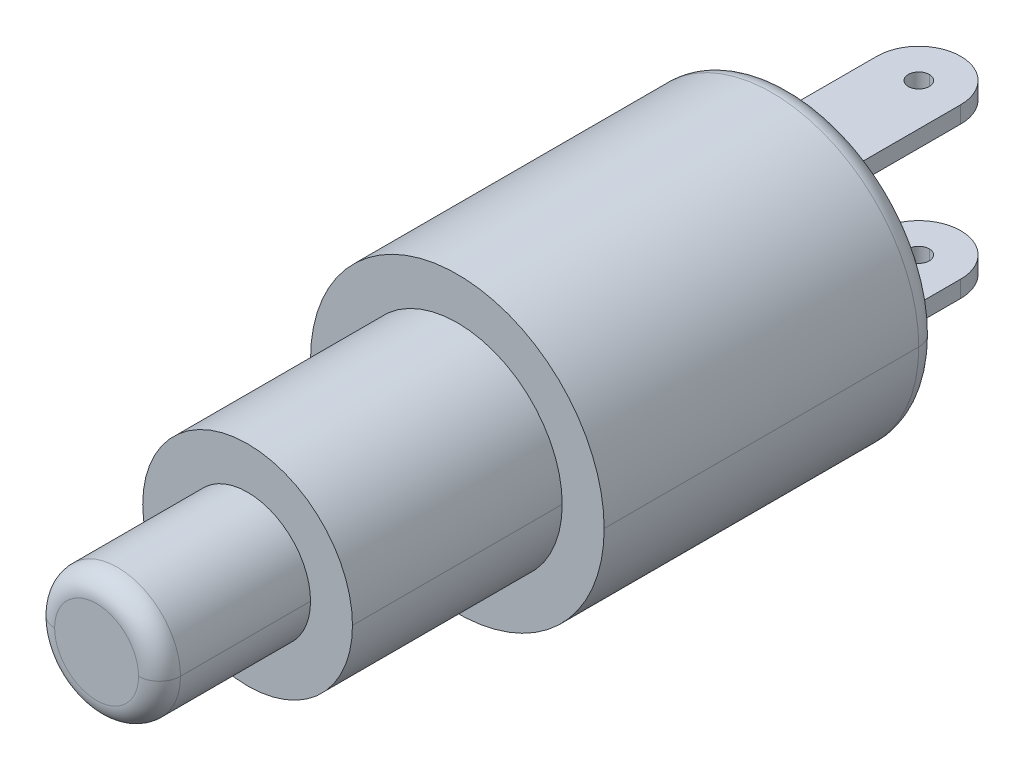
ISO-10303-21;
HEADER;
FILE_DESCRIPTION(('STEP AP214'),'2;1');
FILE_NAME('part.step','',(''),(''),'','','');
FILE_SCHEMA(('AUTOMOTIVE_DESIGN { 1 0 10303 214 1 1 1 1 }'));
ENDSEC;
DATA;
#1=APPLICATION_CONTEXT('core data for automotive mechanical design processes');
#2=APPLICATION_PROTOCOL_DEFINITION('international standard','automotive_design',2000,#1);
#3=PRODUCT_CONTEXT('',#1,'mechanical');
#4=PRODUCT('Part','Part','',(#3));
#5=PRODUCT_RELATED_PRODUCT_CATEGORY('part','',(#4));
#6=PRODUCT_DEFINITION_FORMATION('','',#4);
#7=PRODUCT_DEFINITION_CONTEXT('part definition',#1,'design');
#8=PRODUCT_DEFINITION('design','',#6,#7);
#9=PRODUCT_DEFINITION_SHAPE('','',#8);
#10=(LENGTH_UNIT() NAMED_UNIT(*) SI_UNIT(.MILLI.,.METRE.));
#11=(NAMED_UNIT(*) PLANE_ANGLE_UNIT() SI_UNIT($,.RADIAN.));
#12=(NAMED_UNIT(*) SI_UNIT($,.STERADIAN.) SOLID_ANGLE_UNIT());
#13=UNCERTAINTY_MEASURE_WITH_UNIT(LENGTH_MEASURE(1.E-05),#10,'distance_accuracy_value','');
#14=(GEOMETRIC_REPRESENTATION_CONTEXT(3) GLOBAL_UNCERTAINTY_ASSIGNED_CONTEXT((#13)) GLOBAL_UNIT_ASSIGNED_CONTEXT((#10,
#11,#12)) REPRESENTATION_CONTEXT('',''));
#15=CARTESIAN_POINT('',(0.,0.,0.));
#16=DIRECTION('',(0.,0.,1.));
#17=DIRECTION('',(1.,0.,0.));
#18=AXIS2_PLACEMENT_3D('',#15,#16,#17);
#19=CARTESIAN_POINT('',(0.,-2.,-3.));
#20=DIRECTION('',(0.,1.,0.));
#21=DIRECTION('',(0.,0.,1.));
#22=AXIS2_PLACEMENT_3D('',#19,#20,#21);
#23=CYLINDRICAL_SURFACE('',#22,0.25);
#24=DIRECTION('',(0.,1.,0.));
#25=VECTOR('',#24,1.);
#26=CARTESIAN_POINT('',(0.,-2.,-3.25));
#27=LINE('',#26,#25);
#28=CARTESIAN_POINT('',(0.,-2.,-3.25));
#29=VERTEX_POINT('',#28);
#30=CARTESIAN_POINT('',(0.,-1.6,-3.25));
#31=VERTEX_POINT('',#30);
#32=EDGE_CURVE('E698',#29,#31,#27,.T.);
#33=ORIENTED_EDGE('',*,*,#32,.F.);
#34=CARTESIAN_POINT('',(0.,-2.,-3.));
#35=DIRECTION('',(0.,1.,0.));
#36=DIRECTION('',(0.,0.,1.));
#37=AXIS2_PLACEMENT_3D('',#34,#35,#36);
#38=CIRCLE('',#37,0.25);
#39=CARTESIAN_POINT('',(0.,-2.,-2.75));
#40=VERTEX_POINT('',#39);
#41=EDGE_CURVE('E355',#40,#29,#38,.T.);
#42=ORIENTED_EDGE('',*,*,#41,.F.);
#43=DIRECTION('',(0.,1.,0.));
#44=VECTOR('',#43,1.);
#45=CARTESIAN_POINT('',(0.,-2.,-2.75));
#46=LINE('',#45,#44);
#47=CARTESIAN_POINT('',(0.,-1.6,-2.75));
#48=VERTEX_POINT('',#47);
#49=EDGE_CURVE('E682',#40,#48,#46,.T.);
#50=ORIENTED_EDGE('',*,*,#49,.T.);
#51=CARTESIAN_POINT('',(0.,-1.6,-3.));
#52=DIRECTION('',(0.,-1.,0.));
#53=DIRECTION('',(0.,0.,-1.));
#54=AXIS2_PLACEMENT_3D('',#51,#52,#53);
#55=CIRCLE('',#54,0.25);
#56=EDGE_CURVE('E371',#31,#48,#55,.T.);
#57=ORIENTED_EDGE('',*,*,#56,.F.);
#58=EDGE_LOOP('',(#33,#42,#50,#57));
#59=FACE_BOUND('',#58,.T.);
#60=ADVANCED_FACE('F17',(#59),#23,.F.);
#61=CARTESIAN_POINT('',(0.,-2.,-3.));
#62=DIRECTION('',(0.,1.,0.));
#63=DIRECTION('',(0.,0.,1.));
#64=AXIS2_PLACEMENT_3D('',#61,#62,#63);
#65=CYLINDRICAL_SURFACE('',#64,0.25);
#66=DIRECTION('',(0.,1.,0.));
#67=VECTOR('',#66,1.);
#68=CARTESIAN_POINT('',(0.,-2.,-3.25));
#69=LINE('',#68,#67);
#70=CARTESIAN_POINT('',(0.,1.6,-3.25));
#71=VERTEX_POINT('',#70);
#72=CARTESIAN_POINT('',(0.,2.,-3.25));
#73=VERTEX_POINT('',#72);
#74=EDGE_CURVE('E670',#71,#73,#69,.T.);
#75=ORIENTED_EDGE('',*,*,#74,.F.);
#76=CARTESIAN_POINT('',(0.,1.6,-3.));
#77=DIRECTION('',(0.,1.,0.));
#78=DIRECTION('',(0.,0.,1.));
#79=AXIS2_PLACEMENT_3D('',#76,#77,#78);
#80=CIRCLE('',#79,0.25);
#81=CARTESIAN_POINT('',(0.,1.6,-2.75));
#82=VERTEX_POINT('',#81);
#83=EDGE_CURVE('E11',#82,#71,#80,.T.);
#84=ORIENTED_EDGE('',*,*,#83,.F.);
#85=DIRECTION('',(0.,1.,0.));
#86=VECTOR('',#85,1.);
#87=CARTESIAN_POINT('',(0.,-2.,-2.75));
#88=LINE('',#87,#86);
#89=CARTESIAN_POINT('',(0.,2.,-2.75));
#90=VERTEX_POINT('',#89);
#91=EDGE_CURVE('E657',#82,#90,#88,.T.);
#92=ORIENTED_EDGE('',*,*,#91,.T.);
#93=CARTESIAN_POINT('',(0.,2.,-3.));
#94=DIRECTION('',(0.,1.,0.));
#95=DIRECTION('',(0.,0.,1.));
#96=AXIS2_PLACEMENT_3D('',#93,#94,#95);
#97=CIRCLE('',#96,0.25);
#98=EDGE_CURVE('E397',#90,#73,#97,.T.);
#99=ORIENTED_EDGE('',*,*,#98,.T.);
#100=EDGE_LOOP('',(#75,#84,#92,#99));
#101=FACE_BOUND('',#100,.T.);
#102=ADVANCED_FACE('F772',(#101),#65,.F.);
#103=CARTESIAN_POINT('',(1.,1.6,-4.));
#104=DIRECTION('',(0.,1.,0.));
#105=DIRECTION('',(1.,0.,0.));
#106=AXIS2_PLACEMENT_3D('',#103,#104,#105);
#107=PLANE('',#106);
#108=ORIENTED_EDGE('',*,*,#83,.T.);
#109=CARTESIAN_POINT('',(0.,1.6,-3.));
#110=DIRECTION('',(0.,1.,0.));
#111=DIRECTION('',(0.,0.,1.));
#112=AXIS2_PLACEMENT_3D('',#109,#110,#111);
#113=CIRCLE('',#112,0.25);
#114=EDGE_CURVE('E675',#71,#82,#113,.T.);
#115=ORIENTED_EDGE('',*,*,#114,.T.);
#116=EDGE_LOOP('',(#108,#115));
#117=FACE_BOUND('',#116,.T.);
#118=DIRECTION('',(0.,0.,1.));
#119=VECTOR('',#118,1.);
#120=CARTESIAN_POINT('',(-1.,1.6,-4.));
#121=LINE('',#120,#119);
#122=CARTESIAN_POINT('',(-1.,1.6,-3.));
#123=VERTEX_POINT('',#122);
#124=CARTESIAN_POINT('',(-1.,1.6,0.));
#125=VERTEX_POINT('',#124);
#126=EDGE_CURVE('E370',#123,#125,#121,.T.);
#127=ORIENTED_EDGE('',*,*,#126,.F.);
#128=CARTESIAN_POINT('',(0.,1.6,-3.));
#129=DIRECTION('',(0.,-1.,0.));
#130=DIRECTION('',(0.,0.,1.));
#131=AXIS2_PLACEMENT_3D('',#128,#129,#130);
#132=CIRCLE('',#131,1.);
#133=CARTESIAN_POINT('',(0.,1.6,-4.));
#134=VERTEX_POINT('',#133);
#135=EDGE_CURVE('E308',#123,#134,#132,.T.);
#136=ORIENTED_EDGE('',*,*,#135,.T.);
#137=CARTESIAN_POINT('',(0.,1.6,-3.));
#138=DIRECTION('',(0.,-1.,0.));
#139=DIRECTION('',(0.,0.,1.));
#140=AXIS2_PLACEMENT_3D('',#137,#138,#139);
#141=CIRCLE('',#140,1.);
#142=CARTESIAN_POINT('',(1.,1.6,-3.));
#143=VERTEX_POINT('',#142);
#144=EDGE_CURVE('E338',#134,#143,#141,.T.);
#145=ORIENTED_EDGE('',*,*,#144,.T.);
#146=DIRECTION('',(0.,0.,1.));
#147=VECTOR('',#146,1.);
#148=CARTESIAN_POINT('',(1.,1.6,-4.));
#149=LINE('',#148,#147);
#150=CARTESIAN_POINT('',(1.,1.6,0.));
#151=VERTEX_POINT('',#150);
#152=EDGE_CURVE('E25',#143,#151,#149,.T.);
#153=ORIENTED_EDGE('',*,*,#152,.T.);
#154=DIRECTION('',(-1.,0.,0.));
#155=VECTOR('',#154,1.);
#156=CARTESIAN_POINT('',(1.,1.6,0.));
#157=LINE('',#156,#155);
#158=EDGE_CURVE('E291',#151,#125,#157,.T.);
#159=ORIENTED_EDGE('',*,*,#158,.T.);
#160=EDGE_LOOP('',(#127,#136,#145,#153,#159));
#161=FACE_BOUND('',#160,.T.);
#162=ADVANCED_FACE('F776',(#117,#161),#107,.F.);
#163=CARTESIAN_POINT('',(1.,2.,-4.));
#164=DIRECTION('',(-1.,0.,0.));
#165=DIRECTION('',(0.,0.,1.));
#166=AXIS2_PLACEMENT_3D('',#163,#164,#165);
#167=PLANE('',#166);
#168=ORIENTED_EDGE('',*,*,#152,.F.);
#169=DIRECTION('',(0.,1.,0.));
#170=VECTOR('',#169,1.);
#171=CARTESIAN_POINT('',(1.,1.6,-3.));
#172=LINE('',#171,#170);
#173=CARTESIAN_POINT('',(1.,2.,-3.));
#174=VERTEX_POINT('',#173);
#175=EDGE_CURVE('E335',#143,#174,#172,.T.);
#176=ORIENTED_EDGE('',*,*,#175,.T.);
#177=DIRECTION('',(0.,0.,1.));
#178=VECTOR('',#177,1.);
#179=CARTESIAN_POINT('',(1.,2.,-4.));
#180=LINE('',#179,#178);
#181=CARTESIAN_POINT('',(1.,2.,0.));
#182=VERTEX_POINT('',#181);
#183=EDGE_CURVE('E38',#174,#182,#180,.T.);
#184=ORIENTED_EDGE('',*,*,#183,.T.);
#185=DIRECTION('',(0.,-1.,0.));
#186=VECTOR('',#185,1.);
#187=CARTESIAN_POINT('',(1.,2.,0.));
#188=LINE('',#187,#186);
#189=EDGE_CURVE('E287',#182,#151,#188,.T.);
#190=ORIENTED_EDGE('',*,*,#189,.T.);
#191=EDGE_LOOP('',(#168,#176,#184,#190));
#192=FACE_BOUND('',#191,.T.);
#193=ADVANCED_FACE('F781',(#192),#167,.F.);
#194=CARTESIAN_POINT('',(1.,2.,-4.));
#195=DIRECTION('',(0.,-1.,0.));
#196=DIRECTION('',(0.,0.,-1.));
#197=AXIS2_PLACEMENT_3D('',#194,#195,#196);
#198=PLANE('',#197);
#199=ORIENTED_EDGE('',*,*,#98,.F.);
#200=CARTESIAN_POINT('',(0.,2.,-3.));
#201=DIRECTION('',(0.,1.,0.));
#202=DIRECTION('',(0.,0.,1.));
#203=AXIS2_PLACEMENT_3D('',#200,#201,#202);
#204=CIRCLE('',#203,0.25);
#205=EDGE_CURVE('E624',#73,#90,#204,.T.);
#206=ORIENTED_EDGE('',*,*,#205,.F.);
#207=EDGE_LOOP('',(#199,#206));
#208=FACE_BOUND('',#207,.T.);
#209=ORIENTED_EDGE('',*,*,#183,.F.);
#210=CARTESIAN_POINT('',(0.,2.,-3.));
#211=DIRECTION('',(0.,1.,0.));
#212=DIRECTION('',(0.,0.,-1.));
#213=AXIS2_PLACEMENT_3D('',#210,#211,#212);
#214=CIRCLE('',#213,1.);
#215=CARTESIAN_POINT('',(0.,2.,-4.));
#216=VERTEX_POINT('',#215);
#217=EDGE_CURVE('E332',#174,#216,#214,.T.);
#218=ORIENTED_EDGE('',*,*,#217,.T.);
#219=CARTESIAN_POINT('',(0.,2.,-3.));
#220=DIRECTION('',(0.,1.,0.));
#221=DIRECTION('',(0.,0.,-1.));
#222=AXIS2_PLACEMENT_3D('',#219,#220,#221);
#223=CIRCLE('',#222,1.);
#224=CARTESIAN_POINT('',(-1.,2.,-3.));
#225=VERTEX_POINT('',#224);
#226=EDGE_CURVE('E234',#216,#225,#223,.T.);
#227=ORIENTED_EDGE('',*,*,#226,.T.);
#228=DIRECTION('',(0.,0.,1.));
#229=VECTOR('',#228,1.);
#230=CARTESIAN_POINT('',(-1.,2.,-4.));
#231=LINE('',#230,#229);
#232=CARTESIAN_POINT('',(-1.,2.,0.));
#233=VERTEX_POINT('',#232);
#234=EDGE_CURVE('E367',#225,#233,#231,.T.);
#235=ORIENTED_EDGE('',*,*,#234,.T.);
#236=DIRECTION('',(1.,0.,0.));
#237=VECTOR('',#236,1.);
#238=CARTESIAN_POINT('',(1.,2.,0.));
#239=LINE('',#238,#237);
#240=EDGE_CURVE('E290',#233,#182,#239,.T.);
#241=ORIENTED_EDGE('',*,*,#240,.T.);
#242=EDGE_LOOP('',(#209,#218,#227,#235,#241));
#243=FACE_BOUND('',#242,.T.);
#244=ADVANCED_FACE('F788',(#208,#243),#198,.F.);
#245=CARTESIAN_POINT('',(-1.,2.,-4.));
#246=DIRECTION('',(1.,0.,0.));
#247=DIRECTION('',(0.,1.,0.));
#248=AXIS2_PLACEMENT_3D('',#245,#246,#247);
#249=PLANE('',#248);
#250=ORIENTED_EDGE('',*,*,#234,.F.);
#251=DIRECTION('',(0.,-1.,0.));
#252=VECTOR('',#251,1.);
#253=CARTESIAN_POINT('',(-1.,1.6,-3.));
#254=LINE('',#253,#252);
#255=EDGE_CURVE('E312',#225,#123,#254,.T.);
#256=ORIENTED_EDGE('',*,*,#255,.T.);
#257=ORIENTED_EDGE('',*,*,#126,.T.);
#258=DIRECTION('',(0.,1.,0.));
#259=VECTOR('',#258,1.);
#260=CARTESIAN_POINT('',(-1.,2.,0.));
#261=LINE('',#260,#259);
#262=EDGE_CURVE('E354',#125,#233,#261,.T.);
#263=ORIENTED_EDGE('',*,*,#262,.T.);
#264=EDGE_LOOP('',(#250,#256,#257,#263));
#265=FACE_BOUND('',#264,.T.);
#266=ADVANCED_FACE('F742',(#265),#249,.F.);
#267=CARTESIAN_POINT('',(1.,-1.6,-4.));
#268=DIRECTION('',(0.,-1.,0.));
#269=DIRECTION('',(0.,0.,-1.));
#270=AXIS2_PLACEMENT_3D('',#267,#268,#269);
#271=PLANE('',#270);
#272=CARTESIAN_POINT('',(0.,-1.6,-3.));
#273=DIRECTION('',(0.,-1.,0.));
#274=DIRECTION('',(0.,0.,-1.));
#275=AXIS2_PLACEMENT_3D('',#272,#273,#274);
#276=CIRCLE('',#275,0.25);
#277=EDGE_CURVE('E690',#48,#31,#276,.T.);
#278=ORIENTED_EDGE('',*,*,#277,.T.);
#279=ORIENTED_EDGE('',*,*,#56,.T.);
#280=EDGE_LOOP('',(#278,#279));
#281=FACE_BOUND('',#280,.T.);
#282=DIRECTION('',(0.,0.,1.));
#283=VECTOR('',#282,1.);
#284=CARTESIAN_POINT('',(1.,-1.6,-4.));
#285=LINE('',#284,#283);
#286=CARTESIAN_POINT('',(1.,-1.6,-3.));
#287=VERTEX_POINT('',#286);
#288=CARTESIAN_POINT('',(1.,-1.6,0.));
#289=VERTEX_POINT('',#288);
#290=EDGE_CURVE('E384',#287,#289,#285,.T.);
#291=ORIENTED_EDGE('',*,*,#290,.F.);
#292=CARTESIAN_POINT('',(0.,-1.6,-3.));
#293=DIRECTION('',(0.,1.,0.));
#294=DIRECTION('',(0.,0.,-1.));
#295=AXIS2_PLACEMENT_3D('',#292,#293,#294);
#296=CIRCLE('',#295,1.);
#297=CARTESIAN_POINT('',(-1.,-1.6,-3.));
#298=VERTEX_POINT('',#297);
#299=EDGE_CURVE('E320',#287,#298,#296,.T.);
#300=ORIENTED_EDGE('',*,*,#299,.T.);
#301=DIRECTION('',(0.,0.,1.));
#302=VECTOR('',#301,1.);
#303=CARTESIAN_POINT('',(-1.,-1.6,-4.));
#304=LINE('',#303,#302);
#305=CARTESIAN_POINT('',(-1.,-1.6,0.));
#306=VERTEX_POINT('',#305);
#307=EDGE_CURVE('E358',#298,#306,#304,.T.);
#308=ORIENTED_EDGE('',*,*,#307,.T.);
#309=DIRECTION('',(1.,0.,0.));
#310=VECTOR('',#309,1.);
#311=CARTESIAN_POINT('',(1.,-1.6,0.));
#312=LINE('',#311,#310);
#313=EDGE_CURVE('E345',#306,#289,#312,.T.);
#314=ORIENTED_EDGE('',*,*,#313,.T.);
#315=EDGE_LOOP('',(#291,#300,#308,#314));
#316=FACE_BOUND('',#315,.T.);
#317=ADVANCED_FACE('F738',(#281,#316),#271,.F.);
#318=CARTESIAN_POINT('',(-1.,-1.6,-4.));
#319=DIRECTION('',(1.,0.,0.));
#320=DIRECTION('',(0.,-1.,0.));
#321=AXIS2_PLACEMENT_3D('',#318,#319,#320);
#322=PLANE('',#321);
#323=ORIENTED_EDGE('',*,*,#307,.F.);
#324=DIRECTION('',(0.,-1.,0.));
#325=VECTOR('',#324,1.);
#326=CARTESIAN_POINT('',(-1.,-1.6,-3.));
#327=LINE('',#326,#325);
#328=CARTESIAN_POINT('',(-1.,-2.,-3.));
#329=VERTEX_POINT('',#328);
#330=EDGE_CURVE('E316',#298,#329,#327,.T.);
#331=ORIENTED_EDGE('',*,*,#330,.T.);
#332=DIRECTION('',(0.,0.,1.));
#333=VECTOR('',#332,1.);
#334=CARTESIAN_POINT('',(-1.,-2.,-4.));
#335=LINE('',#334,#333);
#336=CARTESIAN_POINT('',(-1.,-2.,0.));
#337=VERTEX_POINT('',#336);
#338=EDGE_CURVE('E359',#329,#337,#335,.T.);
#339=ORIENTED_EDGE('',*,*,#338,.T.);
#340=DIRECTION('',(0.,1.,0.));
#341=VECTOR('',#340,1.);
#342=CARTESIAN_POINT('',(-1.,-1.6,0.));
#343=LINE('',#342,#341);
#344=EDGE_CURVE('E349',#337,#306,#343,.T.);
#345=ORIENTED_EDGE('',*,*,#344,.T.);
#346=EDGE_LOOP('',(#323,#331,#339,#345));
#347=FACE_BOUND('',#346,.T.);
#348=ADVANCED_FACE('F741',(#347),#322,.F.);
#349=CARTESIAN_POINT('',(1.,-2.,-4.));
#350=DIRECTION('',(0.,1.,0.));
#351=DIRECTION('',(1.,0.,0.));
#352=AXIS2_PLACEMENT_3D('',#349,#350,#351);
#353=PLANE('',#352);
#354=ORIENTED_EDGE('',*,*,#41,.T.);
#355=CARTESIAN_POINT('',(0.,-2.,-3.));
#356=DIRECTION('',(0.,1.,0.));
#357=DIRECTION('',(0.,0.,1.));
#358=AXIS2_PLACEMENT_3D('',#355,#356,#357);
#359=CIRCLE('',#358,0.25);
#360=EDGE_CURVE('E705',#29,#40,#359,.T.);
#361=ORIENTED_EDGE('',*,*,#360,.T.);
#362=EDGE_LOOP('',(#354,#361));
#363=FACE_BOUND('',#362,.T.);
#364=ORIENTED_EDGE('',*,*,#338,.F.);
#365=CARTESIAN_POINT('',(0.,-2.,-3.));
#366=DIRECTION('',(0.,-1.,0.));
#367=DIRECTION('',(0.,0.,1.));
#368=AXIS2_PLACEMENT_3D('',#365,#366,#367);
#369=CIRCLE('',#368,1.);
#370=CARTESIAN_POINT('',(1.,-2.,-3.));
#371=VERTEX_POINT('',#370);
#372=EDGE_CURVE('E328',#329,#371,#369,.T.);
#373=ORIENTED_EDGE('',*,*,#372,.T.);
#374=DIRECTION('',(0.,0.,1.));
#375=VECTOR('',#374,1.);
#376=CARTESIAN_POINT('',(1.,-2.,-4.));
#377=LINE('',#376,#375);
#378=CARTESIAN_POINT('',(1.,-2.,0.));
#379=VERTEX_POINT('',#378);
#380=EDGE_CURVE('E381',#371,#379,#377,.T.);
#381=ORIENTED_EDGE('',*,*,#380,.T.);
#382=DIRECTION('',(-1.,0.,0.));
#383=VECTOR('',#382,1.);
#384=CARTESIAN_POINT('',(1.,-2.,0.));
#385=LINE('',#384,#383);
#386=EDGE_CURVE('E350',#379,#337,#385,.T.);
#387=ORIENTED_EDGE('',*,*,#386,.T.);
#388=EDGE_LOOP('',(#364,#373,#381,#387));
#389=FACE_BOUND('',#388,.T.);
#390=ADVANCED_FACE('F729',(#363,#389),#353,.F.);
#391=CARTESIAN_POINT('',(1.,-1.6,-4.));
#392=DIRECTION('',(-1.,0.,0.));
#393=DIRECTION('',(0.,0.,1.));
#394=AXIS2_PLACEMENT_3D('',#391,#392,#393);
#395=PLANE('',#394);
#396=ORIENTED_EDGE('',*,*,#380,.F.);
#397=DIRECTION('',(0.,1.,0.));
#398=VECTOR('',#397,1.);
#399=CARTESIAN_POINT('',(1.,-1.6,-3.));
#400=LINE('',#399,#398);
#401=EDGE_CURVE('E324',#371,#287,#400,.T.);
#402=ORIENTED_EDGE('',*,*,#401,.T.);
#403=ORIENTED_EDGE('',*,*,#290,.T.);
#404=DIRECTION('',(0.,-1.,0.));
#405=VECTOR('',#404,1.);
#406=CARTESIAN_POINT('',(1.,-1.6,0.));
#407=LINE('',#406,#405);
#408=EDGE_CURVE('E344',#289,#379,#407,.T.);
#409=ORIENTED_EDGE('',*,*,#408,.T.);
#410=EDGE_LOOP('',(#396,#402,#403,#409));
#411=FACE_BOUND('',#410,.T.);
#412=ADVANCED_FACE('F750',(#411),#395,.F.);
#413=CARTESIAN_POINT('',(0.,0.,16.1));
#414=DIRECTION('',(0.,0.,1.));
#415=DIRECTION('',(1.,0.,0.));
#416=AXIS2_PLACEMENT_3D('',#413,#414,#415);
#417=TOROIDAL_SURFACE('',#416,1.,0.5);
#418=CARTESIAN_POINT('',(-1.,0.,16.1));
#419=DIRECTION('',(0.,1.,0.));
#420=DIRECTION('',(-1.,0.,0.));
#421=AXIS2_PLACEMENT_3D('',#418,#419,#420);
#422=CIRCLE('',#421,0.5);
#423=CARTESIAN_POINT('',(-1.5,0.,16.1));
#424=VERTEX_POINT('',#423);
#425=CARTESIAN_POINT('',(-1.,0.,16.6));
#426=VERTEX_POINT('',#425);
#427=EDGE_CURVE('E642',#424,#426,#422,.T.);
#428=ORIENTED_EDGE('',*,*,#427,.F.);
#429=CARTESIAN_POINT('',(0.,0.,16.1));
#430=DIRECTION('',(0.,0.,-1.));
#431=DIRECTION('',(1.,0.,0.));
#432=AXIS2_PLACEMENT_3D('',#429,#430,#431);
#433=CIRCLE('',#432,1.5);
#434=CARTESIAN_POINT('',(1.5,0.,16.1));
#435=VERTEX_POINT('',#434);
#436=EDGE_CURVE('E296',#435,#424,#433,.T.);
#437=ORIENTED_EDGE('',*,*,#436,.F.);
#438=CARTESIAN_POINT('',(1.,0.,16.1));
#439=DIRECTION('',(0.,-1.,0.));
#440=DIRECTION('',(0.,0.,-1.));
#441=AXIS2_PLACEMENT_3D('',#438,#439,#440);
#442=CIRCLE('',#441,0.5);
#443=CARTESIAN_POINT('',(1.,0.,16.6));
#444=VERTEX_POINT('',#443);
#445=EDGE_CURVE('E251',#435,#444,#442,.T.);
#446=ORIENTED_EDGE('',*,*,#445,.T.);
#447=CARTESIAN_POINT('',(0.,0.,16.6));
#448=DIRECTION('',(0.,0.,1.));
#449=DIRECTION('',(1.,0.,0.));
#450=AXIS2_PLACEMENT_3D('',#447,#448,#449);
#451=CIRCLE('',#450,1.);
#452=EDGE_CURVE('E298',#426,#444,#451,.T.);
#453=ORIENTED_EDGE('',*,*,#452,.F.);
#454=EDGE_LOOP('',(#428,#437,#446,#453));
#455=FACE_BOUND('',#454,.T.);
#456=ADVANCED_FACE('F767',(#455),#417,.T.);
#457=CARTESIAN_POINT('',(0.,0.,0.5));
#458=DIRECTION('',(0.,0.,1.));
#459=DIRECTION('',(1.,0.,0.));
#460=AXIS2_PLACEMENT_3D('',#457,#458,#459);
#461=TOROIDAL_SURFACE('',#460,3.,0.5);
#462=CARTESIAN_POINT('',(-3.,0.,0.5));
#463=DIRECTION('',(0.,1.,0.));
#464=DIRECTION('',(-1.,0.,0.));
#465=AXIS2_PLACEMENT_3D('',#462,#463,#464);
#466=CIRCLE('',#465,0.5);
#467=CARTESIAN_POINT('',(-3.,0.,0.));
#468=VERTEX_POINT('',#467);
#469=CARTESIAN_POINT('',(-3.5,0.,0.5));
#470=VERTEX_POINT('',#469);
#471=EDGE_CURVE('E214',#468,#470,#466,.T.);
#472=ORIENTED_EDGE('',*,*,#471,.F.);
#473=CARTESIAN_POINT('',(0.,0.,0.));
#474=DIRECTION('',(0.,0.,-1.));
#475=DIRECTION('',(1.,0.,0.));
#476=AXIS2_PLACEMENT_3D('',#473,#474,#475);
#477=CIRCLE('',#476,3.);
#478=CARTESIAN_POINT('',(3.,0.,0.));
#479=VERTEX_POINT('',#478);
#480=EDGE_CURVE('E341',#479,#468,#477,.T.);
#481=ORIENTED_EDGE('',*,*,#480,.F.);
#482=CARTESIAN_POINT('',(3.,0.,0.5));
#483=DIRECTION('',(0.,-1.,0.));
#484=DIRECTION('',(0.,0.,-1.));
#485=AXIS2_PLACEMENT_3D('',#482,#483,#484);
#486=CIRCLE('',#485,0.5);
#487=CARTESIAN_POINT('',(3.5,0.,0.5));
#488=VERTEX_POINT('',#487);
#489=EDGE_CURVE('E217',#479,#488,#486,.T.);
#490=ORIENTED_EDGE('',*,*,#489,.T.);
#491=CARTESIAN_POINT('',(0.,0.,0.5));
#492=DIRECTION('',(0.,0.,1.));
#493=DIRECTION('',(1.,0.,0.));
#494=AXIS2_PLACEMENT_3D('',#491,#492,#493);
#495=CIRCLE('',#494,3.5);
#496=EDGE_CURVE('E210',#470,#488,#495,.T.);
#497=ORIENTED_EDGE('',*,*,#496,.F.);
#498=EDGE_LOOP('',(#472,#481,#490,#497));
#499=FACE_BOUND('',#498,.T.);
#500=ADVANCED_FACE('F212',(#499),#461,.T.);
#501=CARTESIAN_POINT('',(0.,0.,16.6));
#502=DIRECTION('',(0.,0.,1.));
#503=DIRECTION('',(1.,0.,0.));
#504=AXIS2_PLACEMENT_3D('',#501,#502,#503);
#505=PLANE('',#504);
#506=CARTESIAN_POINT('',(0.,0.,16.6));
#507=DIRECTION('',(0.,0.,1.));
#508=DIRECTION('',(1.,0.,0.));
#509=AXIS2_PLACEMENT_3D('',#506,#507,#508);
#510=CIRCLE('',#509,1.);
#511=EDGE_CURVE('E635',#444,#426,#510,.T.);
#512=ORIENTED_EDGE('',*,*,#511,.T.);
#513=ORIENTED_EDGE('',*,*,#452,.T.);
#514=EDGE_LOOP('',(#512,#513));
#515=FACE_BOUND('',#514,.T.);
#516=ADVANCED_FACE('F828',(#515),#505,.T.);
#517=CARTESIAN_POINT('',(0.,0.,16.6));
#518=DIRECTION('',(0.,0.,-1.));
#519=DIRECTION('',(-1.,0.,0.));
#520=AXIS2_PLACEMENT_3D('',#517,#518,#519);
#521=CYLINDRICAL_SURFACE('',#520,1.5);
#522=DIRECTION('',(0.,0.,-1.));
#523=VECTOR('',#522,1.);
#524=CARTESIAN_POINT('',(1.5,0.,16.6));
#525=LINE('',#524,#523);
#526=CARTESIAN_POINT('',(1.5,0.,13.));
#527=VERTEX_POINT('',#526);
#528=EDGE_CURVE('E258',#435,#527,#525,.T.);
#529=ORIENTED_EDGE('',*,*,#528,.F.);
#530=ORIENTED_EDGE('',*,*,#436,.T.);
#531=DIRECTION('',(0.,0.,-1.));
#532=VECTOR('',#531,1.);
#533=CARTESIAN_POINT('',(-1.5,0.,16.6));
#534=LINE('',#533,#532);
#535=CARTESIAN_POINT('',(-1.5,0.,13.));
#536=VERTEX_POINT('',#535);
#537=EDGE_CURVE('E266',#424,#536,#534,.T.);
#538=ORIENTED_EDGE('',*,*,#537,.T.);
#539=CARTESIAN_POINT('',(0.,0.,13.));
#540=DIRECTION('',(0.,0.,1.));
#541=DIRECTION('',(1.,0.,0.));
#542=AXIS2_PLACEMENT_3D('',#539,#540,#541);
#543=CIRCLE('',#542,1.5);
#544=EDGE_CURVE('E299',#536,#527,#543,.T.);
#545=ORIENTED_EDGE('',*,*,#544,.T.);
#546=EDGE_LOOP('',(#529,#530,#538,#545));
#547=FACE_BOUND('',#546,.T.);
#548=ADVANCED_FACE('F831',(#547),#521,.T.);
#549=CARTESIAN_POINT('',(0.,0.,13.));
#550=DIRECTION('',(0.,0.,1.));
#551=DIRECTION('',(1.,0.,0.));
#552=AXIS2_PLACEMENT_3D('',#549,#550,#551);
#553=PLANE('',#552);
#554=ORIENTED_EDGE('',*,*,#544,.F.);
#555=CARTESIAN_POINT('',(0.,0.,13.));
#556=DIRECTION('',(0.,0.,1.));
#557=DIRECTION('',(1.,0.,0.));
#558=AXIS2_PLACEMENT_3D('',#555,#556,#557);
#559=CIRCLE('',#558,1.5);
#560=EDGE_CURVE('E262',#527,#536,#559,.T.);
#561=ORIENTED_EDGE('',*,*,#560,.F.);
#562=EDGE_LOOP('',(#554,#561));
#563=FACE_BOUND('',#562,.T.);
#564=CARTESIAN_POINT('',(0.,0.,13.));
#565=DIRECTION('',(0.,0.,1.));
#566=DIRECTION('',(1.,0.,0.));
#567=AXIS2_PLACEMENT_3D('',#564,#565,#566);
#568=CIRCLE('',#567,2.5);
#569=CARTESIAN_POINT('',(-2.5,0.,13.));
#570=VERTEX_POINT('',#569);
#571=CARTESIAN_POINT('',(2.5,0.,13.));
#572=VERTEX_POINT('',#571);
#573=EDGE_CURVE('E373',#570,#572,#568,.T.);
#574=ORIENTED_EDGE('',*,*,#573,.T.);
#575=CARTESIAN_POINT('',(0.,0.,13.));
#576=DIRECTION('',(0.,0.,1.));
#577=DIRECTION('',(1.,0.,0.));
#578=AXIS2_PLACEMENT_3D('',#575,#576,#577);
#579=CIRCLE('',#578,2.5);
#580=EDGE_CURVE('E270',#572,#570,#579,.T.);
#581=ORIENTED_EDGE('',*,*,#580,.T.);
#582=EDGE_LOOP('',(#574,#581));
#583=FACE_BOUND('',#582,.T.);
#584=ADVANCED_FACE('F852',(#563,#583),#553,.T.);
#585=CARTESIAN_POINT('',(0.,0.,13.));
#586=DIRECTION('',(0.,0.,-1.));
#587=DIRECTION('',(-1.,0.,0.));
#588=AXIS2_PLACEMENT_3D('',#585,#586,#587);
#589=CYLINDRICAL_SURFACE('',#588,2.5);
#590=DIRECTION('',(0.,0.,-1.));
#591=VECTOR('',#590,1.);
#592=CARTESIAN_POINT('',(2.5,0.,13.));
#593=LINE('',#592,#591);
#594=CARTESIAN_POINT('',(2.5,0.,8.));
#595=VERTEX_POINT('',#594);
#596=EDGE_CURVE('E274',#572,#595,#593,.T.);
#597=ORIENTED_EDGE('',*,*,#596,.F.);
#598=ORIENTED_EDGE('',*,*,#573,.F.);
#599=DIRECTION('',(0.,0.,-1.));
#600=VECTOR('',#599,1.);
#601=CARTESIAN_POINT('',(-2.5,0.,13.));
#602=LINE('',#601,#600);
#603=CARTESIAN_POINT('',(-2.5,0.,8.));
#604=VERTEX_POINT('',#603);
#605=EDGE_CURVE('E282',#570,#604,#602,.T.);
#606=ORIENTED_EDGE('',*,*,#605,.T.);
#607=CARTESIAN_POINT('',(0.,0.,8.));
#608=DIRECTION('',(0.,0.,1.));
#609=DIRECTION('',(1.,0.,0.));
#610=AXIS2_PLACEMENT_3D('',#607,#608,#609);
#611=CIRCLE('',#610,2.5);
#612=EDGE_CURVE('E223',#604,#595,#611,.T.);
#613=ORIENTED_EDGE('',*,*,#612,.T.);
#614=EDGE_LOOP('',(#597,#598,#606,#613));
#615=FACE_BOUND('',#614,.T.);
#616=ADVANCED_FACE('F826',(#615),#589,.T.);
#617=CARTESIAN_POINT('',(0.,0.,8.));
#618=DIRECTION('',(0.,0.,1.));
#619=DIRECTION('',(1.,0.,0.));
#620=AXIS2_PLACEMENT_3D('',#617,#618,#619);
#621=PLANE('',#620);
#622=ORIENTED_EDGE('',*,*,#612,.F.);
#623=CARTESIAN_POINT('',(0.,0.,8.));
#624=DIRECTION('',(0.,0.,1.));
#625=DIRECTION('',(1.,0.,0.));
#626=AXIS2_PLACEMENT_3D('',#623,#624,#625);
#627=CIRCLE('',#626,2.5);
#628=EDGE_CURVE('E278',#595,#604,#627,.T.);
#629=ORIENTED_EDGE('',*,*,#628,.F.);
#630=EDGE_LOOP('',(#622,#629));
#631=FACE_BOUND('',#630,.T.);
#632=CARTESIAN_POINT('',(0.,0.,8.));
#633=DIRECTION('',(0.,0.,1.));
#634=DIRECTION('',(1.,0.,0.));
#635=AXIS2_PLACEMENT_3D('',#632,#633,#634);
#636=CIRCLE('',#635,3.5);
#637=CARTESIAN_POINT('',(-3.5,0.,8.));
#638=VERTEX_POINT('',#637);
#639=CARTESIAN_POINT('',(3.5,0.,8.));
#640=VERTEX_POINT('',#639);
#641=EDGE_CURVE('E224',#638,#640,#636,.T.);
#642=ORIENTED_EDGE('',*,*,#641,.T.);
#643=CARTESIAN_POINT('',(0.,0.,8.));
#644=DIRECTION('',(0.,0.,1.));
#645=DIRECTION('',(1.,0.,0.));
#646=AXIS2_PLACEMENT_3D('',#643,#644,#645);
#647=CIRCLE('',#646,3.5);
#648=EDGE_CURVE('E286',#640,#638,#647,.T.);
#649=ORIENTED_EDGE('',*,*,#648,.T.);
#650=EDGE_LOOP('',(#642,#649));
#651=FACE_BOUND('',#650,.T.);
#652=ADVANCED_FACE('F819',(#631,#651),#621,.T.);
#653=CARTESIAN_POINT('',(0.,0.,8.));
#654=DIRECTION('',(0.,0.,-1.));
#655=DIRECTION('',(-1.,0.,0.));
#656=AXIS2_PLACEMENT_3D('',#653,#654,#655);
#657=CYLINDRICAL_SURFACE('',#656,3.5);
#658=DIRECTION('',(0.,0.,-1.));
#659=VECTOR('',#658,1.);
#660=CARTESIAN_POINT('',(3.5,0.,8.));
#661=LINE('',#660,#659);
#662=EDGE_CURVE('E235',#640,#488,#661,.T.);
#663=ORIENTED_EDGE('',*,*,#662,.F.);
#664=ORIENTED_EDGE('',*,*,#641,.F.);
#665=DIRECTION('',(0.,0.,-1.));
#666=VECTOR('',#665,1.);
#667=CARTESIAN_POINT('',(-3.5,0.,8.));
#668=LINE('',#667,#666);
#669=EDGE_CURVE('E227',#638,#470,#668,.T.);
#670=ORIENTED_EDGE('',*,*,#669,.T.);
#671=ORIENTED_EDGE('',*,*,#496,.T.);
#672=EDGE_LOOP('',(#663,#664,#670,#671));
#673=FACE_BOUND('',#672,.T.);
#674=ADVANCED_FACE('F229',(#673),#657,.T.);
#675=CARTESIAN_POINT('',(0.,0.,0.));
#676=DIRECTION('',(0.,0.,1.));
#677=DIRECTION('',(1.,0.,0.));
#678=AXIS2_PLACEMENT_3D('',#675,#676,#677);
#679=PLANE('',#678);
#680=ORIENTED_EDGE('',*,*,#262,.F.);
#681=ORIENTED_EDGE('',*,*,#158,.F.);
#682=ORIENTED_EDGE('',*,*,#189,.F.);
#683=ORIENTED_EDGE('',*,*,#240,.F.);
#684=EDGE_LOOP('',(#680,#681,#682,#683));
#685=FACE_BOUND('',#684,.T.);
#686=ORIENTED_EDGE('',*,*,#408,.F.);
#687=ORIENTED_EDGE('',*,*,#313,.F.);
#688=ORIENTED_EDGE('',*,*,#344,.F.);
#689=ORIENTED_EDGE('',*,*,#386,.F.);
#690=EDGE_LOOP('',(#686,#687,#688,#689));
#691=FACE_BOUND('',#690,.T.);
#692=ORIENTED_EDGE('',*,*,#480,.T.);
#693=CARTESIAN_POINT('',(0.,0.,0.));
#694=DIRECTION('',(0.,0.,-1.));
#695=DIRECTION('',(1.,0.,0.));
#696=AXIS2_PLACEMENT_3D('',#693,#694,#695);
#697=CIRCLE('',#696,3.);
#698=EDGE_CURVE('E244',#468,#479,#697,.T.);
#699=ORIENTED_EDGE('',*,*,#698,.T.);
#700=EDGE_LOOP('',(#692,#699));
#701=FACE_BOUND('',#700,.T.);
#702=ADVANCED_FACE('F758',(#685,#691,#701),#679,.F.);
#703=CARTESIAN_POINT('',(0.,1.6,-3.));
#704=DIRECTION('',(0.,-1.,0.));
#705=DIRECTION('',(0.,0.,-1.));
#706=AXIS2_PLACEMENT_3D('',#703,#704,#705);
#707=CYLINDRICAL_SURFACE('',#706,1.);
#708=DIRECTION('',(0.,-1.,0.));
#709=VECTOR('',#708,1.);
#710=CARTESIAN_POINT('',(0.,1.6,-4.));
#711=LINE('',#710,#709);
#712=EDGE_CURVE('E304',#216,#134,#711,.T.);
#713=ORIENTED_EDGE('',*,*,#712,.F.);
#714=ORIENTED_EDGE('',*,*,#217,.F.);
#715=ORIENTED_EDGE('',*,*,#175,.F.);
#716=ORIENTED_EDGE('',*,*,#144,.F.);
#717=EDGE_LOOP('',(#713,#714,#715,#716));
#718=FACE_BOUND('',#717,.T.);
#719=ADVANCED_FACE('F808',(#718),#707,.T.);
#720=CARTESIAN_POINT('',(0.,-1.6,-3.));
#721=DIRECTION('',(0.,1.,0.));
#722=DIRECTION('',(-1.,0.,0.));
#723=AXIS2_PLACEMENT_3D('',#720,#721,#722);
#724=CYLINDRICAL_SURFACE('',#723,1.);
#725=ORIENTED_EDGE('',*,*,#330,.F.);
#726=ORIENTED_EDGE('',*,*,#299,.F.);
#727=ORIENTED_EDGE('',*,*,#401,.F.);
#728=ORIENTED_EDGE('',*,*,#372,.F.);
#729=EDGE_LOOP('',(#725,#726,#727,#728));
#730=FACE_BOUND('',#729,.T.);
#731=ADVANCED_FACE('F753',(#730),#724,.T.);
#732=CARTESIAN_POINT('',(0.,1.6,-3.));
#733=DIRECTION('',(0.,-1.,0.));
#734=DIRECTION('',(0.,0.,-1.));
#735=AXIS2_PLACEMENT_3D('',#732,#733,#734);
#736=CYLINDRICAL_SURFACE('',#735,1.);
#737=ORIENTED_EDGE('',*,*,#226,.F.);
#738=ORIENTED_EDGE('',*,*,#712,.T.);
#739=ORIENTED_EDGE('',*,*,#135,.F.);
#740=ORIENTED_EDGE('',*,*,#255,.F.);
#741=EDGE_LOOP('',(#737,#738,#739,#740));
#742=FACE_BOUND('',#741,.T.);
#743=ADVANCED_FACE('F803',(#742),#736,.T.);
#744=CARTESIAN_POINT('',(0.,0.,8.));
#745=DIRECTION('',(0.,0.,-1.));
#746=DIRECTION('',(-1.,0.,0.));
#747=AXIS2_PLACEMENT_3D('',#744,#745,#746);
#748=CYLINDRICAL_SURFACE('',#747,3.5);
#749=ORIENTED_EDGE('',*,*,#648,.F.);
#750=ORIENTED_EDGE('',*,*,#662,.T.);
#751=CARTESIAN_POINT('',(0.,0.,0.5));
#752=DIRECTION('',(0.,0.,1.));
#753=DIRECTION('',(1.,0.,0.));
#754=AXIS2_PLACEMENT_3D('',#751,#752,#753);
#755=CIRCLE('',#754,3.5);
#756=EDGE_CURVE('E237',#488,#470,#755,.T.);
#757=ORIENTED_EDGE('',*,*,#756,.T.);
#758=ORIENTED_EDGE('',*,*,#669,.F.);
#759=EDGE_LOOP('',(#749,#750,#757,#758));
#760=FACE_BOUND('',#759,.T.);
#761=ADVANCED_FACE('F238',(#760),#748,.T.);
#762=CARTESIAN_POINT('',(0.,0.,13.));
#763=DIRECTION('',(0.,0.,-1.));
#764=DIRECTION('',(-1.,0.,0.));
#765=AXIS2_PLACEMENT_3D('',#762,#763,#764);
#766=CYLINDRICAL_SURFACE('',#765,2.5);
#767=ORIENTED_EDGE('',*,*,#580,.F.);
#768=ORIENTED_EDGE('',*,*,#596,.T.);
#769=ORIENTED_EDGE('',*,*,#628,.T.);
#770=ORIENTED_EDGE('',*,*,#605,.F.);
#771=EDGE_LOOP('',(#767,#768,#769,#770));
#772=FACE_BOUND('',#771,.T.);
#773=ADVANCED_FACE('F861',(#772),#766,.T.);
#774=CARTESIAN_POINT('',(0.,0.,16.6));
#775=DIRECTION('',(0.,0.,-1.));
#776=DIRECTION('',(-1.,0.,0.));
#777=AXIS2_PLACEMENT_3D('',#774,#775,#776);
#778=CYLINDRICAL_SURFACE('',#777,1.5);
#779=CARTESIAN_POINT('',(0.,0.,16.1));
#780=DIRECTION('',(0.,0.,-1.));
#781=DIRECTION('',(1.,0.,0.));
#782=AXIS2_PLACEMENT_3D('',#779,#780,#781);
#783=CIRCLE('',#782,1.5);
#784=EDGE_CURVE('E648',#424,#435,#783,.T.);
#785=ORIENTED_EDGE('',*,*,#784,.T.);
#786=ORIENTED_EDGE('',*,*,#528,.T.);
#787=ORIENTED_EDGE('',*,*,#560,.T.);
#788=ORIENTED_EDGE('',*,*,#537,.F.);
#789=EDGE_LOOP('',(#785,#786,#787,#788));
#790=FACE_BOUND('',#789,.T.);
#791=ADVANCED_FACE('F848',(#790),#778,.T.);
#792=CARTESIAN_POINT('',(0.,0.,0.5));
#793=DIRECTION('',(0.,0.,1.));
#794=DIRECTION('',(1.,0.,0.));
#795=AXIS2_PLACEMENT_3D('',#792,#793,#794);
#796=TOROIDAL_SURFACE('',#795,3.,0.5);
#797=ORIENTED_EDGE('',*,*,#698,.F.);
#798=ORIENTED_EDGE('',*,*,#471,.T.);
#799=ORIENTED_EDGE('',*,*,#756,.F.);
#800=ORIENTED_EDGE('',*,*,#489,.F.);
#801=EDGE_LOOP('',(#797,#798,#799,#800));
#802=FACE_BOUND('',#801,.T.);
#803=ADVANCED_FACE('F242',(#802),#796,.T.);
#804=CARTESIAN_POINT('',(0.,0.,16.1));
#805=DIRECTION('',(0.,0.,1.));
#806=DIRECTION('',(1.,0.,0.));
#807=AXIS2_PLACEMENT_3D('',#804,#805,#806);
#808=TOROIDAL_SURFACE('',#807,1.,0.5);
#809=ORIENTED_EDGE('',*,*,#784,.F.);
#810=ORIENTED_EDGE('',*,*,#427,.T.);
#811=ORIENTED_EDGE('',*,*,#511,.F.);
#812=ORIENTED_EDGE('',*,*,#445,.F.);
#813=EDGE_LOOP('',(#809,#810,#811,#812));
#814=FACE_BOUND('',#813,.T.);
#815=ADVANCED_FACE('F845',(#814),#808,.T.);
#816=CARTESIAN_POINT('',(0.,-2.,-3.));
#817=DIRECTION('',(0.,1.,0.));
#818=DIRECTION('',(0.,0.,1.));
#819=AXIS2_PLACEMENT_3D('',#816,#817,#818);
#820=CYLINDRICAL_SURFACE('',#819,0.25);
#821=ORIENTED_EDGE('',*,*,#114,.F.);
#822=ORIENTED_EDGE('',*,*,#74,.T.);
#823=ORIENTED_EDGE('',*,*,#205,.T.);
#824=ORIENTED_EDGE('',*,*,#91,.F.);
#825=EDGE_LOOP('',(#821,#822,#823,#824));
#826=FACE_BOUND('',#825,.T.);
#827=ADVANCED_FACE('F895',(#826),#820,.F.);
#828=CARTESIAN_POINT('',(0.,-2.,-3.));
#829=DIRECTION('',(0.,1.,0.));
#830=DIRECTION('',(0.,0.,1.));
#831=AXIS2_PLACEMENT_3D('',#828,#829,#830);
#832=CYLINDRICAL_SURFACE('',#831,0.25);
#833=ORIENTED_EDGE('',*,*,#360,.F.);
#834=ORIENTED_EDGE('',*,*,#32,.T.);
#835=ORIENTED_EDGE('',*,*,#277,.F.);
#836=ORIENTED_EDGE('',*,*,#49,.F.);
#837=EDGE_LOOP('',(#833,#834,#835,#836));
#838=FACE_BOUND('',#837,.T.);
#839=ADVANCED_FACE('F734',(#838),#832,.F.);
#840=CLOSED_SHELL('',(#60,#102,#162,#193,#244,#266,#317,#348,#390,#412,#456,#500,#516,#548,#584,
#616,#652,#674,#702,#719,#731,#743,#761,#773,#791,#803,#815,#827,#839));
#841=MANIFOLD_SOLID_BREP('B1',#840);
#842=ADVANCED_BREP_SHAPE_REPRESENTATION('',(#18,#841),#14);
#843=SHAPE_DEFINITION_REPRESENTATION(#9,#842);
ENDSEC;
END-ISO-10303-21;
